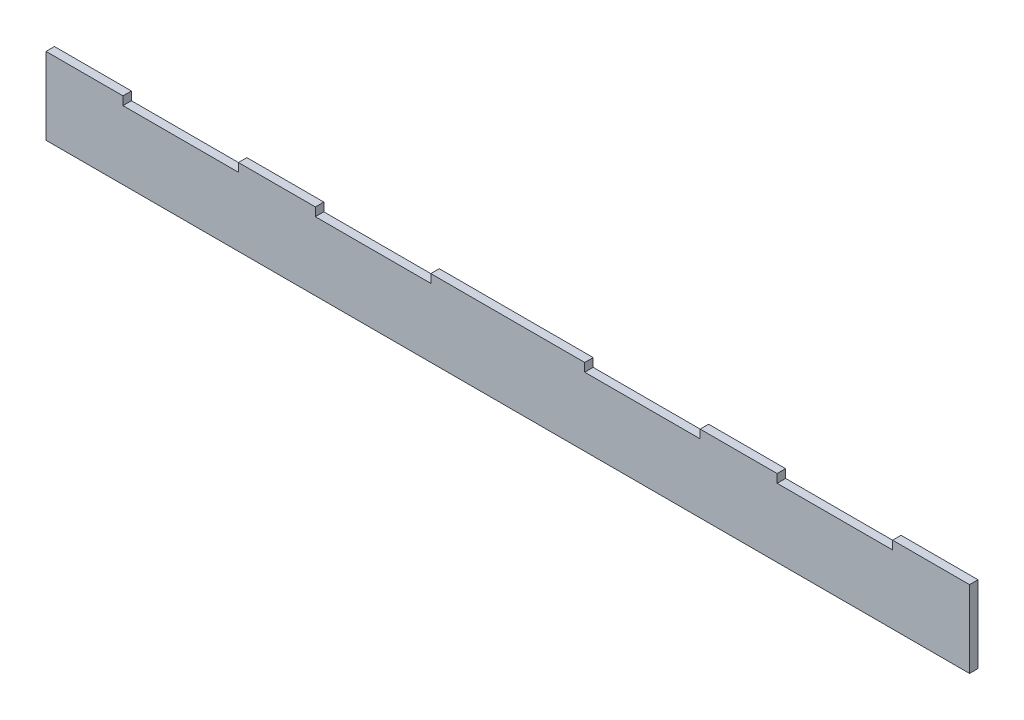
ISO-10303-21;
HEADER;
FILE_DESCRIPTION(('STEP AP214'),'2;1');
FILE_NAME('part.step','',(''),(''),'','','');
FILE_SCHEMA(('AUTOMOTIVE_DESIGN { 1 0 10303 214 1 1 1 1 }'));
ENDSEC;
DATA;
#1=APPLICATION_CONTEXT('core data for automotive mechanical design processes');
#2=APPLICATION_PROTOCOL_DEFINITION('international standard','automotive_design',2000,#1);
#3=PRODUCT_CONTEXT('',#1,'mechanical');
#4=PRODUCT('Part','Part','',(#3));
#5=PRODUCT_RELATED_PRODUCT_CATEGORY('part','',(#4));
#6=PRODUCT_DEFINITION_FORMATION('','',#4);
#7=PRODUCT_DEFINITION_CONTEXT('part definition',#1,'design');
#8=PRODUCT_DEFINITION('design','',#6,#7);
#9=PRODUCT_DEFINITION_SHAPE('','',#8);
#10=(LENGTH_UNIT() NAMED_UNIT(*) SI_UNIT(.MILLI.,.METRE.));
#11=(NAMED_UNIT(*) PLANE_ANGLE_UNIT() SI_UNIT($,.RADIAN.));
#12=(NAMED_UNIT(*) SI_UNIT($,.STERADIAN.) SOLID_ANGLE_UNIT());
#13=UNCERTAINTY_MEASURE_WITH_UNIT(LENGTH_MEASURE(1.E-05),#10,'distance_accuracy_value','');
#14=(GEOMETRIC_REPRESENTATION_CONTEXT(3) GLOBAL_UNCERTAINTY_ASSIGNED_CONTEXT((#13)) GLOBAL_UNIT_ASSIGNED_CONTEXT((#10,
#11,#12)) REPRESENTATION_CONTEXT('',''));
#15=CARTESIAN_POINT('',(0.,0.,0.));
#16=DIRECTION('',(0.,0.,1.));
#17=DIRECTION('',(1.,0.,0.));
#18=AXIS2_PLACEMENT_3D('',#15,#16,#17);
#19=CARTESIAN_POINT('',(-158.244247787611,18.2070796460177,5.588));
#20=DIRECTION('',(1.,0.,0.));
#21=DIRECTION('',(0.,1.,0.));
#22=AXIS2_PLACEMENT_3D('',#19,#20,#21);
#23=PLANE('',#22);
#24=DIRECTION('',(0.,-1.,0.));
#25=VECTOR('',#24,1.);
#26=CARTESIAN_POINT('',(-158.244247787611,18.2070796460177,0.));
#27=LINE('',#26,#25);
#28=CARTESIAN_POINT('',(-158.244247787611,18.2070796460177,0.));
#29=VERTEX_POINT('',#28);
#30=CARTESIAN_POINT('',(-158.244247787611,-32.5929203539823,0.));
#31=VERTEX_POINT('',#30);
#32=EDGE_CURVE('E201',#29,#31,#27,.T.);
#33=ORIENTED_EDGE('',*,*,#32,.T.);
#34=DIRECTION('',(0.,0.,-1.));
#35=VECTOR('',#34,1.);
#36=CARTESIAN_POINT('',(-158.244247787611,-32.5929203539823,5.588));
#37=LINE('',#36,#35);
#38=CARTESIAN_POINT('',(-158.244247787611,-32.5929203539823,5.588));
#39=VERTEX_POINT('',#38);
#40=EDGE_CURVE('E11',#39,#31,#37,.T.);
#41=ORIENTED_EDGE('',*,*,#40,.F.);
#42=DIRECTION('',(0.,-1.,0.));
#43=VECTOR('',#42,1.);
#44=CARTESIAN_POINT('',(-158.244247787611,18.2070796460177,5.588));
#45=LINE('',#44,#43);
#46=CARTESIAN_POINT('',(-158.244247787611,18.2070796460177,5.588));
#47=VERTEX_POINT('',#46);
#48=EDGE_CURVE('E239',#47,#39,#45,.T.);
#49=ORIENTED_EDGE('',*,*,#48,.F.);
#50=DIRECTION('',(0.,0.,-1.));
#51=VECTOR('',#50,1.);
#52=CARTESIAN_POINT('',(-158.244247787611,18.2070796460177,5.588));
#53=LINE('',#52,#51);
#54=EDGE_CURVE('E197',#47,#29,#53,.T.);
#55=ORIENTED_EDGE('',*,*,#54,.T.);
#56=EDGE_LOOP('',(#33,#41,#49,#55));
#57=FACE_BOUND('',#56,.T.);
#58=ADVANCED_FACE('F33',(#57),#23,.F.);
#59=CARTESIAN_POINT('',(-158.244247787611,-32.5929203539823,5.588));
#60=DIRECTION('',(0.,1.,0.));
#61=DIRECTION('',(-1.,0.,0.));
#62=AXIS2_PLACEMENT_3D('',#59,#60,#61);
#63=PLANE('',#62);
#64=DIRECTION('',(1.,0.,0.));
#65=VECTOR('',#64,1.);
#66=CARTESIAN_POINT('',(-158.244247787611,-32.5929203539823,0.));
#67=LINE('',#66,#65);
#68=CARTESIAN_POINT('',(451.355752212389,-32.5929203539823,0.));
#69=VERTEX_POINT('',#68);
#70=EDGE_CURVE('E204',#31,#69,#67,.T.);
#71=ORIENTED_EDGE('',*,*,#70,.T.);
#72=DIRECTION('',(0.,0.,-1.));
#73=VECTOR('',#72,1.);
#74=CARTESIAN_POINT('',(451.355752212389,-32.5929203539823,5.588));
#75=LINE('',#74,#73);
#76=CARTESIAN_POINT('',(451.355752212389,-32.5929203539823,5.588));
#77=VERTEX_POINT('',#76);
#78=EDGE_CURVE('E41',#77,#69,#75,.T.);
#79=ORIENTED_EDGE('',*,*,#78,.F.);
#80=DIRECTION('',(1.,0.,0.));
#81=VECTOR('',#80,1.);
#82=CARTESIAN_POINT('',(-158.244247787611,-32.5929203539823,5.588));
#83=LINE('',#82,#81);
#84=EDGE_CURVE('E128',#39,#77,#83,.T.);
#85=ORIENTED_EDGE('',*,*,#84,.F.);
#86=ORIENTED_EDGE('',*,*,#40,.T.);
#87=EDGE_LOOP('',(#71,#79,#85,#86));
#88=FACE_BOUND('',#87,.T.);
#89=ADVANCED_FACE('F357',(#88),#63,.F.);
#90=CARTESIAN_POINT('',(451.355752212389,18.2070796460177,5.588));
#91=DIRECTION('',(-1.,0.,0.));
#92=DIRECTION('',(0.,0.,1.));
#93=AXIS2_PLACEMENT_3D('',#90,#91,#92);
#94=PLANE('',#93);
#95=DIRECTION('',(0.,1.,0.));
#96=VECTOR('',#95,1.);
#97=CARTESIAN_POINT('',(451.355752212389,18.2070796460177,0.));
#98=LINE('',#97,#96);
#99=CARTESIAN_POINT('',(451.355752212389,18.2070796460177,0.));
#100=VERTEX_POINT('',#99);
#101=EDGE_CURVE('E206',#69,#100,#98,.T.);
#102=ORIENTED_EDGE('',*,*,#101,.T.);
#103=DIRECTION('',(0.,0.,-1.));
#104=VECTOR('',#103,1.);
#105=CARTESIAN_POINT('',(451.355752212389,18.2070796460177,5.588));
#106=LINE('',#105,#104);
#107=CARTESIAN_POINT('',(451.355752212389,18.2070796460177,5.588));
#108=VERTEX_POINT('',#107);
#109=EDGE_CURVE('E282',#108,#100,#106,.T.);
#110=ORIENTED_EDGE('',*,*,#109,.F.);
#111=DIRECTION('',(0.,1.,0.));
#112=VECTOR('',#111,1.);
#113=CARTESIAN_POINT('',(451.355752212389,18.2070796460177,5.588));
#114=LINE('',#113,#112);
#115=EDGE_CURVE('E290',#77,#108,#114,.T.);
#116=ORIENTED_EDGE('',*,*,#115,.F.);
#117=ORIENTED_EDGE('',*,*,#78,.T.);
#118=EDGE_LOOP('',(#102,#110,#116,#117));
#119=FACE_BOUND('',#118,.T.);
#120=ADVANCED_FACE('F288',(#119),#94,.F.);
#121=CARTESIAN_POINT('',(400.555752212389,18.2070796460177,5.588));
#122=DIRECTION('',(0.,-1.,0.));
#123=DIRECTION('',(0.,0.,-1.));
#124=AXIS2_PLACEMENT_3D('',#121,#122,#123);
#125=PLANE('',#124);
#126=DIRECTION('',(-1.,0.,0.));
#127=VECTOR('',#126,1.);
#128=CARTESIAN_POINT('',(400.555752212389,18.2070796460177,0.));
#129=LINE('',#128,#127);
#130=CARTESIAN_POINT('',(400.555752212389,18.2070796460177,0.));
#131=VERTEX_POINT('',#130);
#132=EDGE_CURVE('E208',#100,#131,#129,.T.);
#133=ORIENTED_EDGE('',*,*,#132,.T.);
#134=DIRECTION('',(0.,0.,-1.));
#135=VECTOR('',#134,1.);
#136=CARTESIAN_POINT('',(400.555752212389,18.2070796460177,5.588));
#137=LINE('',#136,#135);
#138=CARTESIAN_POINT('',(400.555752212389,18.2070796460177,5.588));
#139=VERTEX_POINT('',#138);
#140=EDGE_CURVE('E279',#139,#131,#137,.T.);
#141=ORIENTED_EDGE('',*,*,#140,.F.);
#142=DIRECTION('',(-1.,0.,0.));
#143=VECTOR('',#142,1.);
#144=CARTESIAN_POINT('',(400.555752212389,18.2070796460177,5.588));
#145=LINE('',#144,#143);
#146=EDGE_CURVE('E308',#108,#139,#145,.T.);
#147=ORIENTED_EDGE('',*,*,#146,.F.);
#148=ORIENTED_EDGE('',*,*,#109,.T.);
#149=EDGE_LOOP('',(#133,#141,#147,#148));
#150=FACE_BOUND('',#149,.T.);
#151=ADVANCED_FACE('F299',(#150),#125,.F.);
#152=CARTESIAN_POINT('',(400.555752212389,18.2070796460177,5.588));
#153=DIRECTION('',(1.,0.,0.));
#154=DIRECTION('',(0.,1.,0.));
#155=AXIS2_PLACEMENT_3D('',#152,#153,#154);
#156=PLANE('',#155);
#157=DIRECTION('',(0.,-1.,0.));
#158=VECTOR('',#157,1.);
#159=CARTESIAN_POINT('',(400.555752212389,18.2070796460177,0.));
#160=LINE('',#159,#158);
#161=CARTESIAN_POINT('',(400.555752212389,12.6190796460178,0.));
#162=VERTEX_POINT('',#161);
#163=EDGE_CURVE('E210',#131,#162,#160,.T.);
#164=ORIENTED_EDGE('',*,*,#163,.T.);
#165=DIRECTION('',(0.,0.,-1.));
#166=VECTOR('',#165,1.);
#167=CARTESIAN_POINT('',(400.555752212389,12.6190796460178,5.588));
#168=LINE('',#167,#166);
#169=CARTESIAN_POINT('',(400.555752212389,12.6190796460178,5.588));
#170=VERTEX_POINT('',#169);
#171=EDGE_CURVE('E276',#170,#162,#168,.T.);
#172=ORIENTED_EDGE('',*,*,#171,.F.);
#173=DIRECTION('',(0.,-1.,0.));
#174=VECTOR('',#173,1.);
#175=CARTESIAN_POINT('',(400.555752212389,18.2070796460177,5.588));
#176=LINE('',#175,#174);
#177=EDGE_CURVE('E305',#139,#170,#176,.T.);
#178=ORIENTED_EDGE('',*,*,#177,.F.);
#179=ORIENTED_EDGE('',*,*,#140,.T.);
#180=EDGE_LOOP('',(#164,#172,#178,#179));
#181=FACE_BOUND('',#180,.T.);
#182=ADVANCED_FACE('F303',(#181),#156,.F.);
#183=CARTESIAN_POINT('',(324.355752212389,12.6190796460178,5.588));
#184=DIRECTION('',(0.,-1.,0.));
#185=DIRECTION('',(1.,0.,0.));
#186=AXIS2_PLACEMENT_3D('',#183,#184,#185);
#187=PLANE('',#186);
#188=DIRECTION('',(-1.,0.,0.));
#189=VECTOR('',#188,1.);
#190=CARTESIAN_POINT('',(324.355752212389,12.6190796460178,0.));
#191=LINE('',#190,#189);
#192=CARTESIAN_POINT('',(324.355752212389,12.6190796460178,0.));
#193=VERTEX_POINT('',#192);
#194=EDGE_CURVE('E212',#162,#193,#191,.T.);
#195=ORIENTED_EDGE('',*,*,#194,.T.);
#196=DIRECTION('',(0.,0.,-1.));
#197=VECTOR('',#196,1.);
#198=CARTESIAN_POINT('',(324.355752212389,12.6190796460178,5.588));
#199=LINE('',#198,#197);
#200=CARTESIAN_POINT('',(324.355752212389,12.6190796460178,5.588));
#201=VERTEX_POINT('',#200);
#202=EDGE_CURVE('E273',#201,#193,#199,.T.);
#203=ORIENTED_EDGE('',*,*,#202,.F.);
#204=DIRECTION('',(-1.,0.,0.));
#205=VECTOR('',#204,1.);
#206=CARTESIAN_POINT('',(324.355752212389,12.6190796460178,5.588));
#207=LINE('',#206,#205);
#208=EDGE_CURVE('E307',#170,#201,#207,.T.);
#209=ORIENTED_EDGE('',*,*,#208,.F.);
#210=ORIENTED_EDGE('',*,*,#171,.T.);
#211=EDGE_LOOP('',(#195,#203,#209,#210));
#212=FACE_BOUND('',#211,.T.);
#213=ADVANCED_FACE('F370',(#212),#187,.F.);
#214=CARTESIAN_POINT('',(324.355752212389,18.2070796460178,5.588));
#215=DIRECTION('',(-1.,0.,0.));
#216=DIRECTION('',(0.,0.,1.));
#217=AXIS2_PLACEMENT_3D('',#214,#215,#216);
#218=PLANE('',#217);
#219=DIRECTION('',(0.,1.,0.));
#220=VECTOR('',#219,1.);
#221=CARTESIAN_POINT('',(324.355752212389,18.2070796460178,0.));
#222=LINE('',#221,#220);
#223=CARTESIAN_POINT('',(324.355752212389,18.2070796460178,0.));
#224=VERTEX_POINT('',#223);
#225=EDGE_CURVE('E214',#193,#224,#222,.T.);
#226=ORIENTED_EDGE('',*,*,#225,.T.);
#227=DIRECTION('',(0.,0.,-1.));
#228=VECTOR('',#227,1.);
#229=CARTESIAN_POINT('',(324.355752212389,18.2070796460178,5.588));
#230=LINE('',#229,#228);
#231=CARTESIAN_POINT('',(324.355752212389,18.2070796460178,5.588));
#232=VERTEX_POINT('',#231);
#233=EDGE_CURVE('E270',#232,#224,#230,.T.);
#234=ORIENTED_EDGE('',*,*,#233,.F.);
#235=DIRECTION('',(0.,1.,0.));
#236=VECTOR('',#235,1.);
#237=CARTESIAN_POINT('',(324.355752212389,18.2070796460178,5.588));
#238=LINE('',#237,#236);
#239=EDGE_CURVE('E310',#201,#232,#238,.T.);
#240=ORIENTED_EDGE('',*,*,#239,.F.);
#241=ORIENTED_EDGE('',*,*,#202,.T.);
#242=EDGE_LOOP('',(#226,#234,#240,#241));
#243=FACE_BOUND('',#242,.T.);
#244=ADVANCED_FACE('F373',(#243),#218,.F.);
#245=CARTESIAN_POINT('',(273.555752212389,18.2070796460177,5.588));
#246=DIRECTION('',(0.,-1.,0.));
#247=DIRECTION('',(1.,0.,0.));
#248=AXIS2_PLACEMENT_3D('',#245,#246,#247);
#249=PLANE('',#248);
#250=DIRECTION('',(-1.,0.,0.));
#251=VECTOR('',#250,1.);
#252=CARTESIAN_POINT('',(273.555752212389,18.2070796460177,0.));
#253=LINE('',#252,#251);
#254=CARTESIAN_POINT('',(273.555752212389,18.2070796460177,0.));
#255=VERTEX_POINT('',#254);
#256=EDGE_CURVE('E216',#224,#255,#253,.T.);
#257=ORIENTED_EDGE('',*,*,#256,.T.);
#258=DIRECTION('',(0.,0.,-1.));
#259=VECTOR('',#258,1.);
#260=CARTESIAN_POINT('',(273.555752212389,18.2070796460177,5.588));
#261=LINE('',#260,#259);
#262=CARTESIAN_POINT('',(273.555752212389,18.2070796460177,5.588));
#263=VERTEX_POINT('',#262);
#264=EDGE_CURVE('E267',#263,#255,#261,.T.);
#265=ORIENTED_EDGE('',*,*,#264,.F.);
#266=DIRECTION('',(-1.,0.,0.));
#267=VECTOR('',#266,1.);
#268=CARTESIAN_POINT('',(273.555752212389,18.2070796460177,5.588));
#269=LINE('',#268,#267);
#270=EDGE_CURVE('E316',#232,#263,#269,.T.);
#271=ORIENTED_EDGE('',*,*,#270,.F.);
#272=ORIENTED_EDGE('',*,*,#233,.T.);
#273=EDGE_LOOP('',(#257,#265,#271,#272));
#274=FACE_BOUND('',#273,.T.);
#275=ADVANCED_FACE('F377',(#274),#249,.F.);
#276=CARTESIAN_POINT('',(273.555752212389,18.2070796460177,5.588));
#277=DIRECTION('',(1.,0.,0.));
#278=DIRECTION('',(0.,0.,-1.));
#279=AXIS2_PLACEMENT_3D('',#276,#277,#278);
#280=PLANE('',#279);
#281=DIRECTION('',(0.,-1.,0.));
#282=VECTOR('',#281,1.);
#283=CARTESIAN_POINT('',(273.555752212389,18.2070796460177,0.));
#284=LINE('',#283,#282);
#285=CARTESIAN_POINT('',(273.555752212389,12.6190796460178,0.));
#286=VERTEX_POINT('',#285);
#287=EDGE_CURVE('E218',#255,#286,#284,.T.);
#288=ORIENTED_EDGE('',*,*,#287,.T.);
#289=DIRECTION('',(0.,0.,-1.));
#290=VECTOR('',#289,1.);
#291=CARTESIAN_POINT('',(273.555752212389,12.6190796460178,5.588));
#292=LINE('',#291,#290);
#293=CARTESIAN_POINT('',(273.555752212389,12.6190796460178,5.588));
#294=VERTEX_POINT('',#293);
#295=EDGE_CURVE('E264',#294,#286,#292,.T.);
#296=ORIENTED_EDGE('',*,*,#295,.F.);
#297=DIRECTION('',(0.,-1.,0.));
#298=VECTOR('',#297,1.);
#299=CARTESIAN_POINT('',(273.555752212389,18.2070796460177,5.588));
#300=LINE('',#299,#298);
#301=EDGE_CURVE('E318',#263,#294,#300,.T.);
#302=ORIENTED_EDGE('',*,*,#301,.F.);
#303=ORIENTED_EDGE('',*,*,#264,.T.);
#304=EDGE_LOOP('',(#288,#296,#302,#303));
#305=FACE_BOUND('',#304,.T.);
#306=ADVANCED_FACE('F381',(#305),#280,.F.);
#307=CARTESIAN_POINT('',(197.355752212389,12.6190796460178,5.588));
#308=DIRECTION('',(0.,-1.,0.));
#309=DIRECTION('',(0.,0.,-1.));
#310=AXIS2_PLACEMENT_3D('',#307,#308,#309);
#311=PLANE('',#310);
#312=DIRECTION('',(-1.,0.,0.));
#313=VECTOR('',#312,1.);
#314=CARTESIAN_POINT('',(197.355752212389,12.6190796460178,0.));
#315=LINE('',#314,#313);
#316=CARTESIAN_POINT('',(197.355752212389,12.6190796460178,0.));
#317=VERTEX_POINT('',#316);
#318=EDGE_CURVE('E220',#286,#317,#315,.T.);
#319=ORIENTED_EDGE('',*,*,#318,.T.);
#320=DIRECTION('',(0.,0.,-1.));
#321=VECTOR('',#320,1.);
#322=CARTESIAN_POINT('',(197.355752212389,12.6190796460178,5.588));
#323=LINE('',#322,#321);
#324=CARTESIAN_POINT('',(197.355752212389,12.6190796460178,5.588));
#325=VERTEX_POINT('',#324);
#326=EDGE_CURVE('E261',#325,#317,#323,.T.);
#327=ORIENTED_EDGE('',*,*,#326,.F.);
#328=DIRECTION('',(-1.,0.,0.));
#329=VECTOR('',#328,1.);
#330=CARTESIAN_POINT('',(197.355752212389,12.6190796460178,5.588));
#331=LINE('',#330,#329);
#332=EDGE_CURVE('E320',#294,#325,#331,.T.);
#333=ORIENTED_EDGE('',*,*,#332,.F.);
#334=ORIENTED_EDGE('',*,*,#295,.T.);
#335=EDGE_LOOP('',(#319,#327,#333,#334));
#336=FACE_BOUND('',#335,.T.);
#337=ADVANCED_FACE('F385',(#336),#311,.F.);
#338=CARTESIAN_POINT('',(197.355752212389,18.2070796460177,5.588));
#339=DIRECTION('',(-1.,0.,0.));
#340=DIRECTION('',(0.,-1.,0.));
#341=AXIS2_PLACEMENT_3D('',#338,#339,#340);
#342=PLANE('',#341);
#343=DIRECTION('',(0.,1.,0.));
#344=VECTOR('',#343,1.);
#345=CARTESIAN_POINT('',(197.355752212389,18.2070796460177,0.));
#346=LINE('',#345,#344);
#347=CARTESIAN_POINT('',(197.355752212389,18.2070796460177,0.));
#348=VERTEX_POINT('',#347);
#349=EDGE_CURVE('E222',#317,#348,#346,.T.);
#350=ORIENTED_EDGE('',*,*,#349,.T.);
#351=DIRECTION('',(0.,0.,-1.));
#352=VECTOR('',#351,1.);
#353=CARTESIAN_POINT('',(197.355752212389,18.2070796460177,5.588));
#354=LINE('',#353,#352);
#355=CARTESIAN_POINT('',(197.355752212389,18.2070796460177,5.588));
#356=VERTEX_POINT('',#355);
#357=EDGE_CURVE('E258',#356,#348,#354,.T.);
#358=ORIENTED_EDGE('',*,*,#357,.F.);
#359=DIRECTION('',(0.,1.,0.));
#360=VECTOR('',#359,1.);
#361=CARTESIAN_POINT('',(197.355752212389,18.2070796460177,5.588));
#362=LINE('',#361,#360);
#363=EDGE_CURVE('E322',#325,#356,#362,.T.);
#364=ORIENTED_EDGE('',*,*,#363,.F.);
#365=ORIENTED_EDGE('',*,*,#326,.T.);
#366=EDGE_LOOP('',(#350,#358,#364,#365));
#367=FACE_BOUND('',#366,.T.);
#368=ADVANCED_FACE('F389',(#367),#342,.F.);
#369=CARTESIAN_POINT('',(95.7557522123889,18.2070796460174,5.588));
#370=DIRECTION('',(0.,-1.,0.));
#371=DIRECTION('',(1.,0.,0.));
#372=AXIS2_PLACEMENT_3D('',#369,#370,#371);
#373=PLANE('',#372);
#374=DIRECTION('',(-1.,0.,0.));
#375=VECTOR('',#374,1.);
#376=CARTESIAN_POINT('',(95.7557522123889,18.2070796460174,0.));
#377=LINE('',#376,#375);
#378=CARTESIAN_POINT('',(95.7557522123889,18.2070796460174,0.));
#379=VERTEX_POINT('',#378);
#380=EDGE_CURVE('E224',#348,#379,#377,.T.);
#381=ORIENTED_EDGE('',*,*,#380,.T.);
#382=DIRECTION('',(0.,0.,-1.));
#383=VECTOR('',#382,1.);
#384=CARTESIAN_POINT('',(95.7557522123889,18.2070796460174,5.588));
#385=LINE('',#384,#383);
#386=CARTESIAN_POINT('',(95.7557522123889,18.2070796460174,5.588));
#387=VERTEX_POINT('',#386);
#388=EDGE_CURVE('E255',#387,#379,#385,.T.);
#389=ORIENTED_EDGE('',*,*,#388,.F.);
#390=DIRECTION('',(-1.,0.,0.));
#391=VECTOR('',#390,1.);
#392=CARTESIAN_POINT('',(95.7557522123889,18.2070796460174,5.588));
#393=LINE('',#392,#391);
#394=EDGE_CURVE('E324',#356,#387,#393,.T.);
#395=ORIENTED_EDGE('',*,*,#394,.F.);
#396=ORIENTED_EDGE('',*,*,#357,.T.);
#397=EDGE_LOOP('',(#381,#389,#395,#396));
#398=FACE_BOUND('',#397,.T.);
#399=ADVANCED_FACE('F393',(#398),#373,.F.);
#400=CARTESIAN_POINT('',(95.7557522123889,18.2070796460174,5.588));
#401=DIRECTION('',(1.,0.,0.));
#402=DIRECTION('',(0.,1.,0.));
#403=AXIS2_PLACEMENT_3D('',#400,#401,#402);
#404=PLANE('',#403);
#405=DIRECTION('',(0.,-1.,0.));
#406=VECTOR('',#405,1.);
#407=CARTESIAN_POINT('',(95.7557522123889,18.2070796460174,0.));
#408=LINE('',#407,#406);
#409=CARTESIAN_POINT('',(95.7557522123891,12.6190796460178,0.));
#410=VERTEX_POINT('',#409);
#411=EDGE_CURVE('E226',#379,#410,#408,.T.);
#412=ORIENTED_EDGE('',*,*,#411,.T.);
#413=DIRECTION('',(0.,0.,-1.));
#414=VECTOR('',#413,1.);
#415=CARTESIAN_POINT('',(95.7557522123891,12.6190796460178,5.588));
#416=LINE('',#415,#414);
#417=CARTESIAN_POINT('',(95.7557522123891,12.6190796460178,5.588));
#418=VERTEX_POINT('',#417);
#419=EDGE_CURVE('E252',#418,#410,#416,.T.);
#420=ORIENTED_EDGE('',*,*,#419,.F.);
#421=DIRECTION('',(0.,-1.,0.));
#422=VECTOR('',#421,1.);
#423=CARTESIAN_POINT('',(95.7557522123889,18.2070796460174,5.588));
#424=LINE('',#423,#422);
#425=EDGE_CURVE('E326',#387,#418,#424,.T.);
#426=ORIENTED_EDGE('',*,*,#425,.F.);
#427=ORIENTED_EDGE('',*,*,#388,.T.);
#428=EDGE_LOOP('',(#412,#420,#426,#427));
#429=FACE_BOUND('',#428,.T.);
#430=ADVANCED_FACE('F397',(#429),#404,.F.);
#431=CARTESIAN_POINT('',(95.7557522123891,12.6190796460178,5.588));
#432=DIRECTION('',(0.,-1.,0.));
#433=DIRECTION('',(0.,0.,-1.));
#434=AXIS2_PLACEMENT_3D('',#431,#432,#433);
#435=PLANE('',#434);
#436=DIRECTION('',(-1.,0.,0.));
#437=VECTOR('',#436,1.);
#438=CARTESIAN_POINT('',(95.7557522123891,12.6190796460178,0.));
#439=LINE('',#438,#437);
#440=CARTESIAN_POINT('',(19.5557522123892,12.6190796460178,0.));
#441=VERTEX_POINT('',#440);
#442=EDGE_CURVE('E228',#410,#441,#439,.T.);
#443=ORIENTED_EDGE('',*,*,#442,.T.);
#444=DIRECTION('',(0.,0.,-1.));
#445=VECTOR('',#444,1.);
#446=CARTESIAN_POINT('',(19.5557522123892,12.6190796460178,5.588));
#447=LINE('',#446,#445);
#448=CARTESIAN_POINT('',(19.5557522123892,12.6190796460178,5.588));
#449=VERTEX_POINT('',#448);
#450=EDGE_CURVE('E249',#449,#441,#447,.T.);
#451=ORIENTED_EDGE('',*,*,#450,.F.);
#452=DIRECTION('',(-1.,0.,0.));
#453=VECTOR('',#452,1.);
#454=CARTESIAN_POINT('',(95.7557522123891,12.6190796460178,5.588));
#455=LINE('',#454,#453);
#456=EDGE_CURVE('E328',#418,#449,#455,.T.);
#457=ORIENTED_EDGE('',*,*,#456,.F.);
#458=ORIENTED_EDGE('',*,*,#419,.T.);
#459=EDGE_LOOP('',(#443,#451,#457,#458));
#460=FACE_BOUND('',#459,.T.);
#461=ADVANCED_FACE('F401',(#460),#435,.F.);
#462=CARTESIAN_POINT('',(19.5557522123892,18.2070796460177,5.588));
#463=DIRECTION('',(-1.,0.,0.));
#464=DIRECTION('',(0.,0.,1.));
#465=AXIS2_PLACEMENT_3D('',#462,#463,#464);
#466=PLANE('',#465);
#467=DIRECTION('',(0.,1.,0.));
#468=VECTOR('',#467,1.);
#469=CARTESIAN_POINT('',(19.5557522123892,18.2070796460177,0.));
#470=LINE('',#469,#468);
#471=CARTESIAN_POINT('',(19.5557522123892,18.2070796460177,0.));
#472=VERTEX_POINT('',#471);
#473=EDGE_CURVE('E230',#441,#472,#470,.T.);
#474=ORIENTED_EDGE('',*,*,#473,.T.);
#475=DIRECTION('',(0.,0.,-1.));
#476=VECTOR('',#475,1.);
#477=CARTESIAN_POINT('',(19.5557522123892,18.2070796460177,5.588));
#478=LINE('',#477,#476);
#479=CARTESIAN_POINT('',(19.5557522123892,18.2070796460177,5.588));
#480=VERTEX_POINT('',#479);
#481=EDGE_CURVE('E246',#480,#472,#478,.T.);
#482=ORIENTED_EDGE('',*,*,#481,.F.);
#483=DIRECTION('',(0.,1.,0.));
#484=VECTOR('',#483,1.);
#485=CARTESIAN_POINT('',(19.5557522123892,18.2070796460177,5.588));
#486=LINE('',#485,#484);
#487=EDGE_CURVE('E330',#449,#480,#486,.T.);
#488=ORIENTED_EDGE('',*,*,#487,.F.);
#489=ORIENTED_EDGE('',*,*,#450,.T.);
#490=EDGE_LOOP('',(#474,#482,#488,#489));
#491=FACE_BOUND('',#490,.T.);
#492=ADVANCED_FACE('F405',(#491),#466,.F.);
#493=CARTESIAN_POINT('',(-31.2442477876108,18.2070796460178,5.588));
#494=DIRECTION('',(0.,-1.,0.));
#495=DIRECTION('',(1.,0.,0.));
#496=AXIS2_PLACEMENT_3D('',#493,#494,#495);
#497=PLANE('',#496);
#498=DIRECTION('',(-1.,0.,0.));
#499=VECTOR('',#498,1.);
#500=CARTESIAN_POINT('',(-31.2442477876108,18.2070796460178,0.));
#501=LINE('',#500,#499);
#502=CARTESIAN_POINT('',(-31.2442477876108,18.2070796460178,0.));
#503=VERTEX_POINT('',#502);
#504=EDGE_CURVE('E232',#472,#503,#501,.T.);
#505=ORIENTED_EDGE('',*,*,#504,.T.);
#506=DIRECTION('',(0.,0.,-1.));
#507=VECTOR('',#506,1.);
#508=CARTESIAN_POINT('',(-31.2442477876108,18.2070796460178,5.588));
#509=LINE('',#508,#507);
#510=CARTESIAN_POINT('',(-31.2442477876108,18.2070796460178,5.588));
#511=VERTEX_POINT('',#510);
#512=EDGE_CURVE('E243',#511,#503,#509,.T.);
#513=ORIENTED_EDGE('',*,*,#512,.F.);
#514=DIRECTION('',(-1.,0.,0.));
#515=VECTOR('',#514,1.);
#516=CARTESIAN_POINT('',(-31.2442477876108,18.2070796460178,5.588));
#517=LINE('',#516,#515);
#518=EDGE_CURVE('E332',#480,#511,#517,.T.);
#519=ORIENTED_EDGE('',*,*,#518,.F.);
#520=ORIENTED_EDGE('',*,*,#481,.T.);
#521=EDGE_LOOP('',(#505,#513,#519,#520));
#522=FACE_BOUND('',#521,.T.);
#523=ADVANCED_FACE('F338',(#522),#497,.F.);
#524=CARTESIAN_POINT('',(-31.2442477876108,18.2070796460178,5.588));
#525=DIRECTION('',(1.,0.,0.));
#526=DIRECTION('',(0.,0.,-1.));
#527=AXIS2_PLACEMENT_3D('',#524,#525,#526);
#528=PLANE('',#527);
#529=DIRECTION('',(0.,-1.,0.));
#530=VECTOR('',#529,1.);
#531=CARTESIAN_POINT('',(-31.2442477876108,18.2070796460178,0.));
#532=LINE('',#531,#530);
#533=CARTESIAN_POINT('',(-31.2442477876108,12.6190796460178,0.));
#534=VERTEX_POINT('',#533);
#535=EDGE_CURVE('E234',#503,#534,#532,.T.);
#536=ORIENTED_EDGE('',*,*,#535,.T.);
#537=DIRECTION('',(0.,0.,-1.));
#538=VECTOR('',#537,1.);
#539=CARTESIAN_POINT('',(-31.2442477876108,12.6190796460178,5.588));
#540=LINE('',#539,#538);
#541=CARTESIAN_POINT('',(-31.2442477876108,12.6190796460178,5.588));
#542=VERTEX_POINT('',#541);
#543=EDGE_CURVE('E192',#542,#534,#540,.T.);
#544=ORIENTED_EDGE('',*,*,#543,.F.);
#545=DIRECTION('',(0.,-1.,0.));
#546=VECTOR('',#545,1.);
#547=CARTESIAN_POINT('',(-31.2442477876108,18.2070796460178,5.588));
#548=LINE('',#547,#546);
#549=EDGE_CURVE('E183',#511,#542,#548,.T.);
#550=ORIENTED_EDGE('',*,*,#549,.F.);
#551=ORIENTED_EDGE('',*,*,#512,.T.);
#552=EDGE_LOOP('',(#536,#544,#550,#551));
#553=FACE_BOUND('',#552,.T.);
#554=ADVANCED_FACE('F342',(#553),#528,.F.);
#555=CARTESIAN_POINT('',(-31.2442477876108,12.6190796460178,5.588));
#556=DIRECTION('',(0.,-1.,0.));
#557=DIRECTION('',(1.,0.,0.));
#558=AXIS2_PLACEMENT_3D('',#555,#556,#557);
#559=PLANE('',#558);
#560=DIRECTION('',(-1.,0.,0.));
#561=VECTOR('',#560,1.);
#562=CARTESIAN_POINT('',(-31.2442477876108,12.6190796460178,0.));
#563=LINE('',#562,#561);
#564=CARTESIAN_POINT('',(-107.444247787611,12.6190796460178,0.));
#565=VERTEX_POINT('',#564);
#566=EDGE_CURVE('E191',#534,#565,#563,.T.);
#567=ORIENTED_EDGE('',*,*,#566,.T.);
#568=DIRECTION('',(0.,0.,-1.));
#569=VECTOR('',#568,1.);
#570=CARTESIAN_POINT('',(-107.444247787611,12.6190796460178,5.588));
#571=LINE('',#570,#569);
#572=CARTESIAN_POINT('',(-107.444247787611,12.6190796460178,5.588));
#573=VERTEX_POINT('',#572);
#574=EDGE_CURVE('E188',#573,#565,#571,.T.);
#575=ORIENTED_EDGE('',*,*,#574,.F.);
#576=DIRECTION('',(-1.,0.,0.));
#577=VECTOR('',#576,1.);
#578=CARTESIAN_POINT('',(-31.2442477876108,12.6190796460178,5.588));
#579=LINE('',#578,#577);
#580=EDGE_CURVE('E177',#542,#573,#579,.T.);
#581=ORIENTED_EDGE('',*,*,#580,.F.);
#582=ORIENTED_EDGE('',*,*,#543,.T.);
#583=EDGE_LOOP('',(#567,#575,#581,#582));
#584=FACE_BOUND('',#583,.T.);
#585=ADVANCED_FACE('F189',(#584),#559,.F.);
#586=CARTESIAN_POINT('',(-107.444247787611,18.207079646016,5.588));
#587=DIRECTION('',(-1.,0.,0.));
#588=DIRECTION('',(0.,-1.,0.));
#589=AXIS2_PLACEMENT_3D('',#586,#587,#588);
#590=PLANE('',#589);
#591=DIRECTION('',(0.,1.,0.));
#592=VECTOR('',#591,1.);
#593=CARTESIAN_POINT('',(-107.444247787611,18.207079646016,0.));
#594=LINE('',#593,#592);
#595=CARTESIAN_POINT('',(-107.444247787611,18.207079646016,0.));
#596=VERTEX_POINT('',#595);
#597=EDGE_CURVE('E114',#565,#596,#594,.T.);
#598=ORIENTED_EDGE('',*,*,#597,.T.);
#599=DIRECTION('',(0.,0.,-1.));
#600=VECTOR('',#599,1.);
#601=CARTESIAN_POINT('',(-107.444247787611,18.207079646016,5.588));
#602=LINE('',#601,#600);
#603=CARTESIAN_POINT('',(-107.444247787611,18.207079646016,5.588));
#604=VERTEX_POINT('',#603);
#605=EDGE_CURVE('E193',#604,#596,#602,.T.);
#606=ORIENTED_EDGE('',*,*,#605,.F.);
#607=DIRECTION('',(0.,1.,0.));
#608=VECTOR('',#607,1.);
#609=CARTESIAN_POINT('',(-107.444247787611,18.207079646016,5.588));
#610=LINE('',#609,#608);
#611=EDGE_CURVE('E181',#573,#604,#610,.T.);
#612=ORIENTED_EDGE('',*,*,#611,.F.);
#613=ORIENTED_EDGE('',*,*,#574,.T.);
#614=EDGE_LOOP('',(#598,#606,#612,#613));
#615=FACE_BOUND('',#614,.T.);
#616=ADVANCED_FACE('F195',(#615),#590,.F.);
#617=CARTESIAN_POINT('',(-158.244247787611,18.2070796460177,5.588));
#618=DIRECTION('',(0.,-1.,0.));
#619=DIRECTION('',(1.,0.,0.));
#620=AXIS2_PLACEMENT_3D('',#617,#618,#619);
#621=PLANE('',#620);
#622=DIRECTION('',(-1.,0.,0.));
#623=VECTOR('',#622,1.);
#624=CARTESIAN_POINT('',(-158.244247787611,18.2070796460177,0.));
#625=LINE('',#624,#623);
#626=EDGE_CURVE('E120',#596,#29,#625,.T.);
#627=ORIENTED_EDGE('',*,*,#626,.T.);
#628=ORIENTED_EDGE('',*,*,#54,.F.);
#629=DIRECTION('',(-1.,0.,0.));
#630=VECTOR('',#629,1.);
#631=CARTESIAN_POINT('',(-158.244247787611,18.2070796460177,5.588));
#632=LINE('',#631,#630);
#633=EDGE_CURVE('E49',#604,#47,#632,.T.);
#634=ORIENTED_EDGE('',*,*,#633,.F.);
#635=ORIENTED_EDGE('',*,*,#605,.T.);
#636=EDGE_LOOP('',(#627,#628,#634,#635));
#637=FACE_BOUND('',#636,.T.);
#638=ADVANCED_FACE('F346',(#637),#621,.F.);
#639=CARTESIAN_POINT('',(0.,0.,5.588));
#640=DIRECTION('',(0.,0.,1.));
#641=DIRECTION('',(1.,0.,0.));
#642=AXIS2_PLACEMENT_3D('',#639,#640,#641);
#643=PLANE('',#642);
#644=ORIENTED_EDGE('',*,*,#48,.T.);
#645=ORIENTED_EDGE('',*,*,#84,.T.);
#646=ORIENTED_EDGE('',*,*,#115,.T.);
#647=ORIENTED_EDGE('',*,*,#146,.T.);
#648=ORIENTED_EDGE('',*,*,#177,.T.);
#649=ORIENTED_EDGE('',*,*,#208,.T.);
#650=ORIENTED_EDGE('',*,*,#239,.T.);
#651=ORIENTED_EDGE('',*,*,#270,.T.);
#652=ORIENTED_EDGE('',*,*,#301,.T.);
#653=ORIENTED_EDGE('',*,*,#332,.T.);
#654=ORIENTED_EDGE('',*,*,#363,.T.);
#655=ORIENTED_EDGE('',*,*,#394,.T.);
#656=ORIENTED_EDGE('',*,*,#425,.T.);
#657=ORIENTED_EDGE('',*,*,#456,.T.);
#658=ORIENTED_EDGE('',*,*,#487,.T.);
#659=ORIENTED_EDGE('',*,*,#518,.T.);
#660=ORIENTED_EDGE('',*,*,#549,.T.);
#661=ORIENTED_EDGE('',*,*,#580,.T.);
#662=ORIENTED_EDGE('',*,*,#611,.T.);
#663=ORIENTED_EDGE('',*,*,#633,.T.);
#664=EDGE_LOOP('',(#644,#645,#646,#647,#648,#649,#650,#651,#652,#653,#654,#655,#656,#657,#658,
#659,#660,#661,#662,#663));
#665=FACE_BOUND('',#664,.T.);
#666=ADVANCED_FACE('F179',(#665),#643,.T.);
#667=CARTESIAN_POINT('',(0.,0.,0.));
#668=DIRECTION('',(0.,0.,1.));
#669=DIRECTION('',(1.,0.,0.));
#670=AXIS2_PLACEMENT_3D('',#667,#668,#669);
#671=PLANE('',#670);
#672=ORIENTED_EDGE('',*,*,#32,.F.);
#673=ORIENTED_EDGE('',*,*,#626,.F.);
#674=ORIENTED_EDGE('',*,*,#597,.F.);
#675=ORIENTED_EDGE('',*,*,#566,.F.);
#676=ORIENTED_EDGE('',*,*,#535,.F.);
#677=ORIENTED_EDGE('',*,*,#504,.F.);
#678=ORIENTED_EDGE('',*,*,#473,.F.);
#679=ORIENTED_EDGE('',*,*,#442,.F.);
#680=ORIENTED_EDGE('',*,*,#411,.F.);
#681=ORIENTED_EDGE('',*,*,#380,.F.);
#682=ORIENTED_EDGE('',*,*,#349,.F.);
#683=ORIENTED_EDGE('',*,*,#318,.F.);
#684=ORIENTED_EDGE('',*,*,#287,.F.);
#685=ORIENTED_EDGE('',*,*,#256,.F.);
#686=ORIENTED_EDGE('',*,*,#225,.F.);
#687=ORIENTED_EDGE('',*,*,#194,.F.);
#688=ORIENTED_EDGE('',*,*,#163,.F.);
#689=ORIENTED_EDGE('',*,*,#132,.F.);
#690=ORIENTED_EDGE('',*,*,#101,.F.);
#691=ORIENTED_EDGE('',*,*,#70,.F.);
#692=EDGE_LOOP('',(#672,#673,#674,#675,#676,#677,#678,#679,#680,#681,#682,#683,#684,#685,#686,
#687,#688,#689,#690,#691));
#693=FACE_BOUND('',#692,.T.);
#694=ADVANCED_FACE('F294',(#693),#671,.F.);
#695=CLOSED_SHELL('',(#58,#89,#120,#151,#182,#213,#244,#275,#306,#337,#368,#399,#430,#461,#492,
#523,#554,#585,#616,#638,#666,#694));
#696=MANIFOLD_SOLID_BREP('B2',#695);
#697=ADVANCED_BREP_SHAPE_REPRESENTATION('',(#18,#696),#14);
#698=SHAPE_DEFINITION_REPRESENTATION(#9,#697);
ENDSEC;
END-ISO-10303-21;
